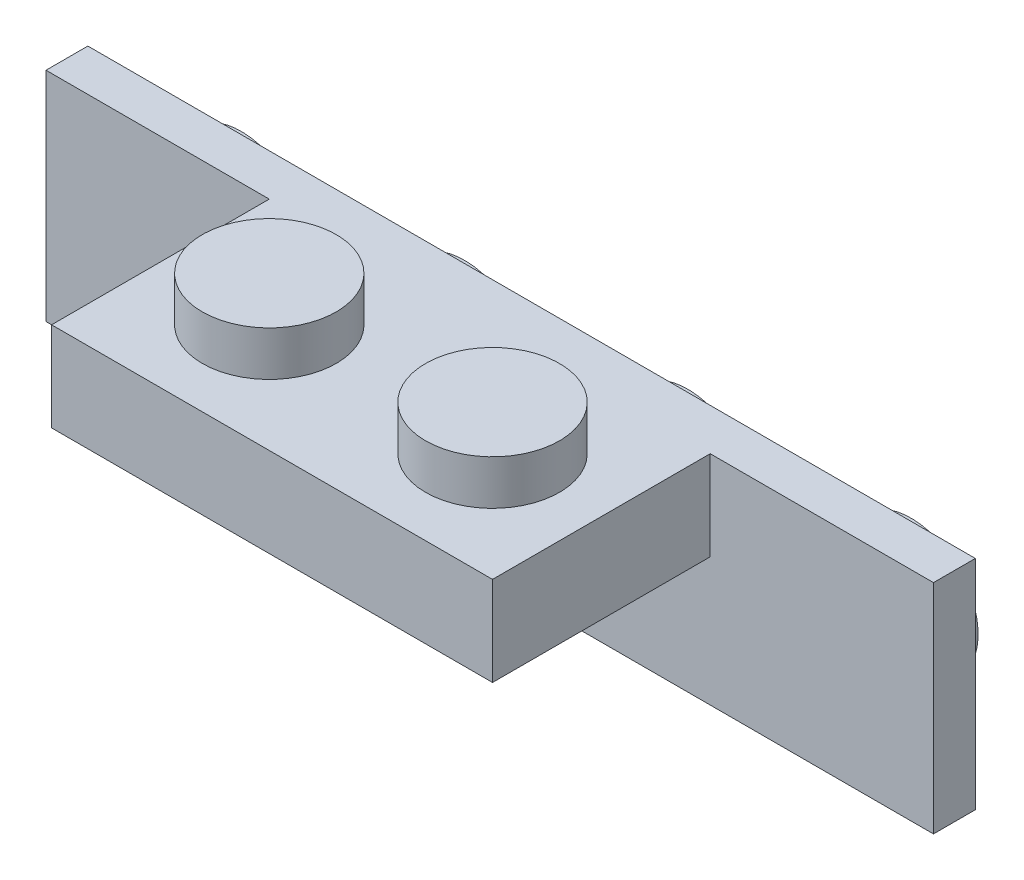
ISO-10303-21;
HEADER;
FILE_DESCRIPTION(('STEP AP214'),'2;1');
FILE_NAME('part.step','',(''),(''),'','','');
FILE_SCHEMA(('AUTOMOTIVE_DESIGN { 1 0 10303 214 1 1 1 1 }'));
ENDSEC;
DATA;
#1=APPLICATION_CONTEXT('core data for automotive mechanical design processes');
#2=APPLICATION_PROTOCOL_DEFINITION('international standard','automotive_design',2000,#1);
#3=PRODUCT_CONTEXT('',#1,'mechanical');
#4=PRODUCT('Part','Part','',(#3));
#5=PRODUCT_RELATED_PRODUCT_CATEGORY('part','',(#4));
#6=PRODUCT_DEFINITION_FORMATION('','',#4);
#7=PRODUCT_DEFINITION_CONTEXT('part definition',#1,'design');
#8=PRODUCT_DEFINITION('design','',#6,#7);
#9=PRODUCT_DEFINITION_SHAPE('','',#8);
#10=(LENGTH_UNIT() NAMED_UNIT(*) SI_UNIT(.MILLI.,.METRE.));
#11=(NAMED_UNIT(*) PLANE_ANGLE_UNIT() SI_UNIT($,.RADIAN.));
#12=(NAMED_UNIT(*) SI_UNIT($,.STERADIAN.) SOLID_ANGLE_UNIT());
#13=UNCERTAINTY_MEASURE_WITH_UNIT(LENGTH_MEASURE(1.E-05),#10,'distance_accuracy_value','');
#14=(GEOMETRIC_REPRESENTATION_CONTEXT(3) GLOBAL_UNCERTAINTY_ASSIGNED_CONTEXT((#13)) GLOBAL_UNIT_ASSIGNED_CONTEXT((#10,
#11,#12)) REPRESENTATION_CONTEXT('',''));
#15=CARTESIAN_POINT('',(0.,0.,0.));
#16=DIRECTION('',(0.,0.,1.));
#17=DIRECTION('',(1.,0.,0.));
#18=AXIS2_PLACEMENT_3D('',#15,#16,#17);
#19=CARTESIAN_POINT('',(0.,0.,-7.8));
#20=DIRECTION('',(0.,-1.,0.));
#21=DIRECTION('',(0.,0.,-1.));
#22=AXIS2_PLACEMENT_3D('',#19,#20,#21);
#23=PLANE('',#22);
#24=DIRECTION('',(1.,0.,0.));
#25=VECTOR('',#24,1.);
#26=CARTESIAN_POINT('',(0.,0.,0.));
#27=LINE('',#26,#25);
#28=CARTESIAN_POINT('',(0.,0.,0.));
#29=VERTEX_POINT('',#28);
#30=CARTESIAN_POINT('',(15.8,0.,0.));
#31=VERTEX_POINT('',#30);
#32=EDGE_CURVE('E103',#29,#31,#27,.T.);
#33=ORIENTED_EDGE('',*,*,#32,.F.);
#34=DIRECTION('',(0.,0.,1.));
#35=VECTOR('',#34,1.);
#36=CARTESIAN_POINT('',(0.,0.,-7.8));
#37=LINE('',#36,#35);
#38=CARTESIAN_POINT('',(0.,0.,-7.8));
#39=VERTEX_POINT('',#38);
#40=EDGE_CURVE('E119',#39,#29,#37,.T.);
#41=ORIENTED_EDGE('',*,*,#40,.F.);
#42=DIRECTION('',(1.,0.,0.));
#43=VECTOR('',#42,1.);
#44=CARTESIAN_POINT('',(0.,0.,-7.8));
#45=LINE('',#44,#43);
#46=CARTESIAN_POINT('',(15.8,0.,-7.8));
#47=VERTEX_POINT('',#46);
#48=EDGE_CURVE('E112',#39,#47,#45,.T.);
#49=ORIENTED_EDGE('',*,*,#48,.T.);
#50=DIRECTION('',(0.,0.,1.));
#51=VECTOR('',#50,1.);
#52=CARTESIAN_POINT('',(15.8,0.,-7.8));
#53=LINE('',#52,#51);
#54=EDGE_CURVE('E95',#47,#31,#53,.T.);
#55=ORIENTED_EDGE('',*,*,#54,.T.);
#56=EDGE_LOOP('',(#33,#41,#49,#55));
#57=FACE_BOUND('',#56,.T.);
#58=DIRECTION('',(0.,0.,1.));
#59=VECTOR('',#58,1.);
#60=CARTESIAN_POINT('',(1.2,0.,-7.8));
#61=LINE('',#60,#59);
#62=CARTESIAN_POINT('',(1.2,0.,-6.6));
#63=VERTEX_POINT('',#62);
#64=CARTESIAN_POINT('',(1.2,0.,-1.2));
#65=VERTEX_POINT('',#64);
#66=EDGE_CURVE('E306',#63,#65,#61,.T.);
#67=ORIENTED_EDGE('',*,*,#66,.T.);
#68=DIRECTION('',(1.,0.,0.));
#69=VECTOR('',#68,1.);
#70=CARTESIAN_POINT('',(0.,0.,-1.2));
#71=LINE('',#70,#69);
#72=CARTESIAN_POINT('',(14.6,0.,-1.2));
#73=VERTEX_POINT('',#72);
#74=EDGE_CURVE('E297',#65,#73,#71,.T.);
#75=ORIENTED_EDGE('',*,*,#74,.T.);
#76=DIRECTION('',(0.,0.,1.));
#77=VECTOR('',#76,1.);
#78=CARTESIAN_POINT('',(14.6,0.,-7.8));
#79=LINE('',#78,#77);
#80=CARTESIAN_POINT('',(14.6,0.,-6.6));
#81=VERTEX_POINT('',#80);
#82=EDGE_CURVE('E302',#81,#73,#79,.T.);
#83=ORIENTED_EDGE('',*,*,#82,.F.);
#84=DIRECTION('',(1.,0.,0.));
#85=VECTOR('',#84,1.);
#86=CARTESIAN_POINT('',(0.,0.,-6.6));
#87=LINE('',#86,#85);
#88=EDGE_CURVE('E57',#63,#81,#87,.T.);
#89=ORIENTED_EDGE('',*,*,#88,.F.);
#90=EDGE_LOOP('',(#67,#75,#83,#89));
#91=FACE_BOUND('',#90,.T.);
#92=ADVANCED_FACE('F42',(#57,#91),#23,.T.);
#93=CARTESIAN_POINT('',(0.,0.,-7.8));
#94=DIRECTION('',(-1.,0.,0.));
#95=DIRECTION('',(0.,0.,1.));
#96=AXIS2_PLACEMENT_3D('',#93,#94,#95);
#97=PLANE('',#96);
#98=DIRECTION('',(0.,-1.,0.));
#99=VECTOR('',#98,1.);
#100=CARTESIAN_POINT('',(0.,0.,0.));
#101=LINE('',#100,#99);
#102=CARTESIAN_POINT('',(0.,3.2,0.));
#103=VERTEX_POINT('',#102);
#104=EDGE_CURVE('E279',#103,#29,#101,.T.);
#105=ORIENTED_EDGE('',*,*,#104,.F.);
#106=DIRECTION('',(0.,0.,1.));
#107=VECTOR('',#106,1.);
#108=CARTESIAN_POINT('',(0.,3.2,-7.8));
#109=LINE('',#108,#107);
#110=CARTESIAN_POINT('',(0.,3.2,-7.8));
#111=VERTEX_POINT('',#110);
#112=EDGE_CURVE('E94',#111,#103,#109,.T.);
#113=ORIENTED_EDGE('',*,*,#112,.F.);
#114=DIRECTION('',(0.,-1.,0.));
#115=VECTOR('',#114,1.);
#116=CARTESIAN_POINT('',(0.,0.,-7.8));
#117=LINE('',#116,#115);
#118=EDGE_CURVE('E109',#111,#39,#117,.T.);
#119=ORIENTED_EDGE('',*,*,#118,.T.);
#120=ORIENTED_EDGE('',*,*,#40,.T.);
#121=EDGE_LOOP('',(#105,#113,#119,#120));
#122=FACE_BOUND('',#121,.T.);
#123=ADVANCED_FACE('F44',(#122),#97,.T.);
#124=CARTESIAN_POINT('',(0.,3.2,-7.8));
#125=DIRECTION('',(0.,1.,0.));
#126=DIRECTION('',(0.,0.,1.));
#127=AXIS2_PLACEMENT_3D('',#124,#125,#126);
#128=PLANE('',#127);
#129=CARTESIAN_POINT('',(11.9,3.2,-3.9));
#130=DIRECTION('',(0.,1.,0.));
#131=DIRECTION('',(0.,0.,1.));
#132=AXIS2_PLACEMENT_3D('',#129,#130,#131);
#133=CIRCLE('',#132,2.4);
#134=CARTESIAN_POINT('',(11.9,3.2,-1.5));
#135=VERTEX_POINT('',#134);
#136=EDGE_CURVE('E293',#135,#135,#133,.T.);
#137=ORIENTED_EDGE('',*,*,#136,.F.);
#138=EDGE_LOOP('',(#137));
#139=FACE_BOUND('',#138,.T.);
#140=CARTESIAN_POINT('',(3.9,3.2,-3.9));
#141=DIRECTION('',(0.,1.,0.));
#142=DIRECTION('',(0.,0.,1.));
#143=AXIS2_PLACEMENT_3D('',#140,#141,#142);
#144=CIRCLE('',#143,2.4);
#145=CARTESIAN_POINT('',(3.9,3.2,-1.5));
#146=VERTEX_POINT('',#145);
#147=EDGE_CURVE('E283',#146,#146,#144,.T.);
#148=ORIENTED_EDGE('',*,*,#147,.F.);
#149=EDGE_LOOP('',(#148));
#150=FACE_BOUND('',#149,.T.);
#151=DIRECTION('',(-1.,0.,0.));
#152=VECTOR('',#151,1.);
#153=CARTESIAN_POINT('',(0.,3.2,0.));
#154=LINE('',#153,#152);
#155=CARTESIAN_POINT('',(15.8,3.2,0.));
#156=VERTEX_POINT('',#155);
#157=EDGE_CURVE('E101',#156,#103,#154,.T.);
#158=ORIENTED_EDGE('',*,*,#157,.F.);
#159=DIRECTION('',(0.,0.,1.));
#160=VECTOR('',#159,1.);
#161=CARTESIAN_POINT('',(15.8,3.2,-7.8));
#162=LINE('',#161,#160);
#163=CARTESIAN_POINT('',(15.8,3.2,-7.8));
#164=VERTEX_POINT('',#163);
#165=EDGE_CURVE('E85',#164,#156,#162,.T.);
#166=ORIENTED_EDGE('',*,*,#165,.F.);
#167=DIRECTION('',(1.,0.,0.));
#168=VECTOR('',#167,1.);
#169=CARTESIAN_POINT('',(-8.,3.2,-7.8));
#170=LINE('',#169,#168);
#171=CARTESIAN_POINT('',(23.8,3.2,-7.8));
#172=VERTEX_POINT('',#171);
#173=EDGE_CURVE('E277',#164,#172,#170,.T.);
#174=ORIENTED_EDGE('',*,*,#173,.T.);
#175=DIRECTION('',(0.,0.,1.));
#176=VECTOR('',#175,1.);
#177=CARTESIAN_POINT('',(23.8,3.2,-9.3));
#178=LINE('',#177,#176);
#179=CARTESIAN_POINT('',(23.8,3.2,-9.3));
#180=VERTEX_POINT('',#179);
#181=EDGE_CURVE('E345',#180,#172,#178,.T.);
#182=ORIENTED_EDGE('',*,*,#181,.F.);
#183=DIRECTION('',(1.,0.,0.));
#184=VECTOR('',#183,1.);
#185=CARTESIAN_POINT('',(0.,3.2,-9.3));
#186=LINE('',#185,#184);
#187=CARTESIAN_POINT('',(-8.,3.2,-9.3));
#188=VERTEX_POINT('',#187);
#189=EDGE_CURVE('E276',#188,#180,#186,.T.);
#190=ORIENTED_EDGE('',*,*,#189,.F.);
#191=DIRECTION('',(0.,0.,1.));
#192=VECTOR('',#191,1.);
#193=CARTESIAN_POINT('',(-8.,3.2,-9.3));
#194=LINE('',#193,#192);
#195=CARTESIAN_POINT('',(-8.,3.2,-7.8));
#196=VERTEX_POINT('',#195);
#197=EDGE_CURVE('E275',#188,#196,#194,.T.);
#198=ORIENTED_EDGE('',*,*,#197,.T.);
#199=EDGE_CURVE('E266',#196,#111,#170,.T.);
#200=ORIENTED_EDGE('',*,*,#199,.T.);
#201=ORIENTED_EDGE('',*,*,#112,.T.);
#202=EDGE_LOOP('',(#158,#166,#174,#182,#190,#198,#200,#201));
#203=FACE_BOUND('',#202,.T.);
#204=ADVANCED_FACE('F105',(#139,#150,#203),#128,.T.);
#205=CARTESIAN_POINT('',(15.8,0.,-7.8));
#206=DIRECTION('',(1.,0.,0.));
#207=DIRECTION('',(0.,0.,-1.));
#208=AXIS2_PLACEMENT_3D('',#205,#206,#207);
#209=PLANE('',#208);
#210=DIRECTION('',(0.,1.,0.));
#211=VECTOR('',#210,1.);
#212=CARTESIAN_POINT('',(15.8,0.,0.));
#213=LINE('',#212,#211);
#214=EDGE_CURVE('E88',#31,#156,#213,.T.);
#215=ORIENTED_EDGE('',*,*,#214,.F.);
#216=ORIENTED_EDGE('',*,*,#54,.F.);
#217=DIRECTION('',(0.,1.,0.));
#218=VECTOR('',#217,1.);
#219=CARTESIAN_POINT('',(15.8,0.,-7.8));
#220=LINE('',#219,#218);
#221=EDGE_CURVE('E66',#47,#164,#220,.T.);
#222=ORIENTED_EDGE('',*,*,#221,.T.);
#223=ORIENTED_EDGE('',*,*,#165,.T.);
#224=EDGE_LOOP('',(#215,#216,#222,#223));
#225=FACE_BOUND('',#224,.T.);
#226=ADVANCED_FACE('F87',(#225),#209,.T.);
#227=CARTESIAN_POINT('',(0.,0.,0.));
#228=DIRECTION('',(0.,0.,-1.));
#229=DIRECTION('',(-1.,0.,0.));
#230=AXIS2_PLACEMENT_3D('',#227,#228,#229);
#231=PLANE('',#230);
#232=ORIENTED_EDGE('',*,*,#104,.T.);
#233=ORIENTED_EDGE('',*,*,#32,.T.);
#234=ORIENTED_EDGE('',*,*,#214,.T.);
#235=ORIENTED_EDGE('',*,*,#157,.T.);
#236=EDGE_LOOP('',(#232,#233,#234,#235));
#237=FACE_BOUND('',#236,.T.);
#238=ADVANCED_FACE('F100',(#237),#231,.F.);
#239=CARTESIAN_POINT('',(3.9,4.8,-3.9));
#240=DIRECTION('',(0.,-1.,0.));
#241=DIRECTION('',(0.,0.,-1.));
#242=AXIS2_PLACEMENT_3D('',#239,#240,#241);
#243=CYLINDRICAL_SURFACE('',#242,2.4);
#244=CARTESIAN_POINT('',(3.9,4.8,-3.9));
#245=DIRECTION('',(0.,1.,0.));
#246=DIRECTION('',(0.,0.,1.));
#247=AXIS2_PLACEMENT_3D('',#244,#245,#246);
#248=CIRCLE('',#247,2.4);
#249=CARTESIAN_POINT('',(3.9,4.8,-1.5));
#250=VERTEX_POINT('',#249);
#251=EDGE_CURVE('E280',#250,#250,#248,.T.);
#252=ORIENTED_EDGE('',*,*,#251,.F.);
#253=EDGE_LOOP('',(#252));
#254=FACE_BOUND('',#253,.T.);
#255=ORIENTED_EDGE('',*,*,#147,.T.);
#256=EDGE_LOOP('',(#255));
#257=FACE_BOUND('',#256,.T.);
#258=ADVANCED_FACE('F175',(#254,#257),#243,.T.);
#259=CARTESIAN_POINT('',(3.9,4.8,-3.9));
#260=DIRECTION('',(0.,1.,0.));
#261=DIRECTION('',(0.,0.,1.));
#262=AXIS2_PLACEMENT_3D('',#259,#260,#261);
#263=PLANE('',#262);
#264=ORIENTED_EDGE('',*,*,#251,.T.);
#265=EDGE_LOOP('',(#264));
#266=FACE_BOUND('',#265,.T.);
#267=ADVANCED_FACE('F178',(#266),#263,.T.);
#268=CARTESIAN_POINT('',(11.9,4.8,-3.9));
#269=DIRECTION('',(0.,-1.,0.));
#270=DIRECTION('',(0.,0.,-1.));
#271=AXIS2_PLACEMENT_3D('',#268,#269,#270);
#272=CYLINDRICAL_SURFACE('',#271,2.4);
#273=CARTESIAN_POINT('',(11.9,4.8,-3.9));
#274=DIRECTION('',(0.,1.,0.));
#275=DIRECTION('',(0.,0.,1.));
#276=AXIS2_PLACEMENT_3D('',#273,#274,#275);
#277=CIRCLE('',#276,2.4);
#278=CARTESIAN_POINT('',(11.9,4.8,-1.5));
#279=VERTEX_POINT('',#278);
#280=EDGE_CURVE('E289',#279,#279,#277,.T.);
#281=ORIENTED_EDGE('',*,*,#280,.F.);
#282=EDGE_LOOP('',(#281));
#283=FACE_BOUND('',#282,.T.);
#284=ORIENTED_EDGE('',*,*,#136,.T.);
#285=EDGE_LOOP('',(#284));
#286=FACE_BOUND('',#285,.T.);
#287=ADVANCED_FACE('F182',(#283,#286),#272,.T.);
#288=CARTESIAN_POINT('',(11.9,4.8,-3.9));
#289=DIRECTION('',(0.,1.,0.));
#290=DIRECTION('',(0.,0.,1.));
#291=AXIS2_PLACEMENT_3D('',#288,#289,#290);
#292=PLANE('',#291);
#293=ORIENTED_EDGE('',*,*,#280,.T.);
#294=EDGE_LOOP('',(#293));
#295=FACE_BOUND('',#294,.T.);
#296=ADVANCED_FACE('F186',(#295),#292,.T.);
#297=CARTESIAN_POINT('',(1.2,0.,-7.8));
#298=DIRECTION('',(-1.,0.,0.));
#299=DIRECTION('',(0.,0.,1.));
#300=AXIS2_PLACEMENT_3D('',#297,#298,#299);
#301=PLANE('',#300);
#302=DIRECTION('',(0.,-1.,0.));
#303=VECTOR('',#302,1.);
#304=CARTESIAN_POINT('',(1.2,0.,-1.2));
#305=LINE('',#304,#303);
#306=CARTESIAN_POINT('',(1.2,2.,-1.2));
#307=VERTEX_POINT('',#306);
#308=EDGE_CURVE('E301',#307,#65,#305,.T.);
#309=ORIENTED_EDGE('',*,*,#308,.T.);
#310=ORIENTED_EDGE('',*,*,#66,.F.);
#311=DIRECTION('',(0.,-1.,0.));
#312=VECTOR('',#311,1.);
#313=CARTESIAN_POINT('',(1.2,0.,-6.6));
#314=LINE('',#313,#312);
#315=CARTESIAN_POINT('',(1.2,2.,-6.6));
#316=VERTEX_POINT('',#315);
#317=EDGE_CURVE('E309',#316,#63,#314,.T.);
#318=ORIENTED_EDGE('',*,*,#317,.F.);
#319=DIRECTION('',(0.,0.,1.));
#320=VECTOR('',#319,1.);
#321=CARTESIAN_POINT('',(1.2,2.,-7.8));
#322=LINE('',#321,#320);
#323=EDGE_CURVE('E296',#316,#307,#322,.T.);
#324=ORIENTED_EDGE('',*,*,#323,.T.);
#325=EDGE_LOOP('',(#309,#310,#318,#324));
#326=FACE_BOUND('',#325,.T.);
#327=ADVANCED_FACE('F190',(#326),#301,.F.);
#328=CARTESIAN_POINT('',(0.,2.,-7.8));
#329=DIRECTION('',(0.,1.,0.));
#330=DIRECTION('',(0.,0.,1.));
#331=AXIS2_PLACEMENT_3D('',#328,#329,#330);
#332=PLANE('',#331);
#333=CARTESIAN_POINT('',(7.9,2.,-3.9));
#334=DIRECTION('',(0.,1.,0.));
#335=DIRECTION('',(0.,0.,1.));
#336=AXIS2_PLACEMENT_3D('',#333,#334,#335);
#337=CIRCLE('',#336,1.5);
#338=CARTESIAN_POINT('',(7.9,2.,-2.4));
#339=VERTEX_POINT('',#338);
#340=EDGE_CURVE('E116',#339,#339,#337,.F.);
#341=ORIENTED_EDGE('',*,*,#340,.F.);
#342=EDGE_LOOP('',(#341));
#343=FACE_BOUND('',#342,.T.);
#344=CARTESIAN_POINT('',(11.9,2.,-3.9));
#345=DIRECTION('',(0.,1.,0.));
#346=DIRECTION('',(0.,0.,1.));
#347=AXIS2_PLACEMENT_3D('',#344,#345,#346);
#348=CIRCLE('',#347,1.2);
#349=CARTESIAN_POINT('',(11.9,2.,-2.7));
#350=VERTEX_POINT('',#349);
#351=EDGE_CURVE('E317',#350,#350,#348,.T.);
#352=ORIENTED_EDGE('',*,*,#351,.T.);
#353=EDGE_LOOP('',(#352));
#354=FACE_BOUND('',#353,.T.);
#355=CARTESIAN_POINT('',(3.9,2.,-3.9));
#356=DIRECTION('',(0.,1.,0.));
#357=DIRECTION('',(0.,0.,1.));
#358=AXIS2_PLACEMENT_3D('',#355,#356,#357);
#359=CIRCLE('',#358,1.2);
#360=CARTESIAN_POINT('',(3.9,2.,-2.7));
#361=VERTEX_POINT('',#360);
#362=EDGE_CURVE('E316',#361,#361,#359,.T.);
#363=ORIENTED_EDGE('',*,*,#362,.T.);
#364=EDGE_LOOP('',(#363));
#365=FACE_BOUND('',#364,.T.);
#366=DIRECTION('',(-1.,0.,0.));
#367=VECTOR('',#366,1.);
#368=CARTESIAN_POINT('',(0.,2.,-1.2));
#369=LINE('',#368,#367);
#370=CARTESIAN_POINT('',(14.6,2.,-1.2));
#371=VERTEX_POINT('',#370);
#372=EDGE_CURVE('E324',#371,#307,#369,.T.);
#373=ORIENTED_EDGE('',*,*,#372,.T.);
#374=ORIENTED_EDGE('',*,*,#323,.F.);
#375=DIRECTION('',(-1.,0.,0.));
#376=VECTOR('',#375,1.);
#377=CARTESIAN_POINT('',(0.,2.,-6.6));
#378=LINE('',#377,#376);
#379=CARTESIAN_POINT('',(14.6,2.,-6.6));
#380=VERTEX_POINT('',#379);
#381=EDGE_CURVE('E312',#380,#316,#378,.T.);
#382=ORIENTED_EDGE('',*,*,#381,.F.);
#383=DIRECTION('',(0.,0.,1.));
#384=VECTOR('',#383,1.);
#385=CARTESIAN_POINT('',(14.6,2.,-7.8));
#386=LINE('',#385,#384);
#387=EDGE_CURVE('E305',#380,#371,#386,.T.);
#388=ORIENTED_EDGE('',*,*,#387,.T.);
#389=EDGE_LOOP('',(#373,#374,#382,#388));
#390=FACE_BOUND('',#389,.T.);
#391=ADVANCED_FACE('F219',(#343,#354,#365,#390),#332,.F.);
#392=CARTESIAN_POINT('',(14.6,0.,-7.8));
#393=DIRECTION('',(1.,0.,0.));
#394=DIRECTION('',(0.,0.,-1.));
#395=AXIS2_PLACEMENT_3D('',#392,#393,#394);
#396=PLANE('',#395);
#397=DIRECTION('',(0.,1.,0.));
#398=VECTOR('',#397,1.);
#399=CARTESIAN_POINT('',(14.6,0.,-1.2));
#400=LINE('',#399,#398);
#401=EDGE_CURVE('E300',#73,#371,#400,.T.);
#402=ORIENTED_EDGE('',*,*,#401,.T.);
#403=ORIENTED_EDGE('',*,*,#387,.F.);
#404=DIRECTION('',(0.,1.,0.));
#405=VECTOR('',#404,1.);
#406=CARTESIAN_POINT('',(14.6,0.,-6.6));
#407=LINE('',#406,#405);
#408=EDGE_CURVE('E308',#81,#380,#407,.T.);
#409=ORIENTED_EDGE('',*,*,#408,.F.);
#410=ORIENTED_EDGE('',*,*,#82,.T.);
#411=EDGE_LOOP('',(#402,#403,#409,#410));
#412=FACE_BOUND('',#411,.T.);
#413=ADVANCED_FACE('F216',(#412),#396,.F.);
#414=CARTESIAN_POINT('',(0.,0.,-6.6));
#415=DIRECTION('',(0.,0.,-1.));
#416=DIRECTION('',(-1.,0.,0.));
#417=AXIS2_PLACEMENT_3D('',#414,#415,#416);
#418=PLANE('',#417);
#419=ORIENTED_EDGE('',*,*,#317,.T.);
#420=ORIENTED_EDGE('',*,*,#88,.T.);
#421=ORIENTED_EDGE('',*,*,#408,.T.);
#422=ORIENTED_EDGE('',*,*,#381,.T.);
#423=EDGE_LOOP('',(#419,#420,#421,#422));
#424=FACE_BOUND('',#423,.T.);
#425=ADVANCED_FACE('F212',(#424),#418,.F.);
#426=CARTESIAN_POINT('',(0.,0.,-1.2));
#427=DIRECTION('',(0.,0.,-1.));
#428=DIRECTION('',(-1.,0.,0.));
#429=AXIS2_PLACEMENT_3D('',#426,#427,#428);
#430=PLANE('',#429);
#431=ORIENTED_EDGE('',*,*,#308,.F.);
#432=ORIENTED_EDGE('',*,*,#372,.F.);
#433=ORIENTED_EDGE('',*,*,#401,.F.);
#434=ORIENTED_EDGE('',*,*,#74,.F.);
#435=EDGE_LOOP('',(#431,#432,#433,#434));
#436=FACE_BOUND('',#435,.T.);
#437=ADVANCED_FACE('F208',(#436),#430,.T.);
#438=CARTESIAN_POINT('',(3.9,4.8,-3.9));
#439=DIRECTION('',(0.,-1.,0.));
#440=DIRECTION('',(0.,0.,-1.));
#441=AXIS2_PLACEMENT_3D('',#438,#439,#440);
#442=CYLINDRICAL_SURFACE('',#441,1.2);
#443=CARTESIAN_POINT('',(3.9,3.6,-3.9));
#444=DIRECTION('',(0.,1.,0.));
#445=DIRECTION('',(0.,0.,1.));
#446=AXIS2_PLACEMENT_3D('',#443,#444,#445);
#447=CIRCLE('',#446,1.2);
#448=CARTESIAN_POINT('',(3.9,3.6,-2.7));
#449=VERTEX_POINT('',#448);
#450=EDGE_CURVE('E318',#449,#449,#447,.T.);
#451=ORIENTED_EDGE('',*,*,#450,.T.);
#452=EDGE_LOOP('',(#451));
#453=FACE_BOUND('',#452,.T.);
#454=ORIENTED_EDGE('',*,*,#362,.F.);
#455=EDGE_LOOP('',(#454));
#456=FACE_BOUND('',#455,.T.);
#457=ADVANCED_FACE('F204',(#453,#456),#442,.F.);
#458=CARTESIAN_POINT('',(3.9,3.6,-3.9));
#459=DIRECTION('',(0.,1.,0.));
#460=DIRECTION('',(0.,0.,1.));
#461=AXIS2_PLACEMENT_3D('',#458,#459,#460);
#462=PLANE('',#461);
#463=ORIENTED_EDGE('',*,*,#450,.F.);
#464=EDGE_LOOP('',(#463));
#465=FACE_BOUND('',#464,.T.);
#466=ADVANCED_FACE('F200',(#465),#462,.F.);
#467=CARTESIAN_POINT('',(11.9,4.8,-3.9));
#468=DIRECTION('',(0.,-1.,0.));
#469=DIRECTION('',(0.,0.,-1.));
#470=AXIS2_PLACEMENT_3D('',#467,#468,#469);
#471=CYLINDRICAL_SURFACE('',#470,1.2);
#472=CARTESIAN_POINT('',(11.9,3.6,-3.9));
#473=DIRECTION('',(0.,1.,0.));
#474=DIRECTION('',(0.,0.,1.));
#475=AXIS2_PLACEMENT_3D('',#472,#473,#474);
#476=CIRCLE('',#475,1.2);
#477=CARTESIAN_POINT('',(11.9,3.6,-2.7));
#478=VERTEX_POINT('',#477);
#479=EDGE_CURVE('E313',#478,#478,#476,.T.);
#480=ORIENTED_EDGE('',*,*,#479,.T.);
#481=EDGE_LOOP('',(#480));
#482=FACE_BOUND('',#481,.T.);
#483=ORIENTED_EDGE('',*,*,#351,.F.);
#484=EDGE_LOOP('',(#483));
#485=FACE_BOUND('',#484,.T.);
#486=ADVANCED_FACE('F196',(#482,#485),#471,.F.);
#487=CARTESIAN_POINT('',(11.9,3.6,-3.9));
#488=DIRECTION('',(0.,1.,0.));
#489=DIRECTION('',(0.,0.,1.));
#490=AXIS2_PLACEMENT_3D('',#487,#488,#489);
#491=PLANE('',#490);
#492=ORIENTED_EDGE('',*,*,#479,.F.);
#493=EDGE_LOOP('',(#492));
#494=FACE_BOUND('',#493,.T.);
#495=ADVANCED_FACE('F192',(#494),#491,.F.);
#496=CARTESIAN_POINT('',(7.9,-4.24264068711929,-3.9));
#497=DIRECTION('',(0.,1.,0.));
#498=DIRECTION('',(0.,0.,1.));
#499=AXIS2_PLACEMENT_3D('',#496,#497,#498);
#500=CYLINDRICAL_SURFACE('',#499,1.5);
#501=ORIENTED_EDGE('',*,*,#340,.T.);
#502=EDGE_LOOP('',(#501));
#503=FACE_BOUND('',#502,.T.);
#504=CARTESIAN_POINT('',(7.9,0.2,-3.9));
#505=DIRECTION('',(0.,-1.,0.));
#506=DIRECTION('',(0.,0.,-1.));
#507=AXIS2_PLACEMENT_3D('',#504,#505,#506);
#508=CIRCLE('',#507,1.5);
#509=CARTESIAN_POINT('',(7.9,0.2,-5.4));
#510=VERTEX_POINT('',#509);
#511=EDGE_CURVE('E335',#510,#510,#508,.T.);
#512=ORIENTED_EDGE('',*,*,#511,.F.);
#513=EDGE_LOOP('',(#512));
#514=FACE_BOUND('',#513,.T.);
#515=ADVANCED_FACE('F195',(#503,#514),#500,.T.);
#516=CARTESIAN_POINT('',(7.9,-4.24264068711929,-3.9));
#517=DIRECTION('',(0.,1.,0.));
#518=DIRECTION('',(0.,0.,1.));
#519=AXIS2_PLACEMENT_3D('',#516,#517,#518);
#520=CYLINDRICAL_SURFACE('',#519,0.6);
#521=CARTESIAN_POINT('',(7.9,2.,-3.9));
#522=DIRECTION('',(0.,-1.,0.));
#523=DIRECTION('',(0.,0.,-1.));
#524=AXIS2_PLACEMENT_3D('',#521,#522,#523);
#525=CIRCLE('',#524,0.6);
#526=CARTESIAN_POINT('',(7.9,2.,-4.5));
#527=VERTEX_POINT('',#526);
#528=EDGE_CURVE('E344',#527,#527,#525,.T.);
#529=ORIENTED_EDGE('',*,*,#528,.F.);
#530=EDGE_LOOP('',(#529));
#531=FACE_BOUND('',#530,.T.);
#532=CARTESIAN_POINT('',(7.9,0.2,-3.9));
#533=DIRECTION('',(0.,-1.,0.));
#534=DIRECTION('',(0.,0.,-1.));
#535=AXIS2_PLACEMENT_3D('',#532,#533,#534);
#536=CIRCLE('',#535,0.6);
#537=CARTESIAN_POINT('',(7.9,0.2,-4.5));
#538=VERTEX_POINT('',#537);
#539=EDGE_CURVE('E341',#538,#538,#536,.T.);
#540=ORIENTED_EDGE('',*,*,#539,.T.);
#541=EDGE_LOOP('',(#540));
#542=FACE_BOUND('',#541,.T.);
#543=ADVANCED_FACE('F230',(#531,#542),#520,.F.);
#544=CARTESIAN_POINT('',(0.,0.2,-7.8));
#545=DIRECTION('',(0.,-1.,0.));
#546=DIRECTION('',(0.,0.,-1.));
#547=AXIS2_PLACEMENT_3D('',#544,#545,#546);
#548=PLANE('',#547);
#549=ORIENTED_EDGE('',*,*,#539,.F.);
#550=EDGE_LOOP('',(#549));
#551=FACE_BOUND('',#550,.T.);
#552=ORIENTED_EDGE('',*,*,#511,.T.);
#553=EDGE_LOOP('',(#552));
#554=FACE_BOUND('',#553,.T.);
#555=ADVANCED_FACE('F234',(#551,#554),#548,.T.);
#556=ORIENTED_EDGE('',*,*,#528,.T.);
#557=EDGE_LOOP('',(#556));
#558=FACE_BOUND('',#557,.T.);
#559=ADVANCED_FACE('F224',(#558),#332,.F.);
#560=CARTESIAN_POINT('',(23.8,3.2,-9.3));
#561=DIRECTION('',(-1.,0.,0.));
#562=DIRECTION('',(0.,0.,1.));
#563=AXIS2_PLACEMENT_3D('',#560,#561,#562);
#564=PLANE('',#563);
#565=DIRECTION('',(0.,-1.,0.));
#566=VECTOR('',#565,1.);
#567=CARTESIAN_POINT('',(23.8,3.2,-7.8));
#568=LINE('',#567,#566);
#569=CARTESIAN_POINT('',(23.8,-4.6,-7.8));
#570=VERTEX_POINT('',#569);
#571=EDGE_CURVE('E366',#172,#570,#568,.T.);
#572=ORIENTED_EDGE('',*,*,#571,.T.);
#573=DIRECTION('',(0.,0.,1.));
#574=VECTOR('',#573,1.);
#575=CARTESIAN_POINT('',(23.8,-4.6,-9.3));
#576=LINE('',#575,#574);
#577=CARTESIAN_POINT('',(23.8,-4.6,-9.3));
#578=VERTEX_POINT('',#577);
#579=EDGE_CURVE('E352',#578,#570,#576,.T.);
#580=ORIENTED_EDGE('',*,*,#579,.F.);
#581=DIRECTION('',(0.,-1.,0.));
#582=VECTOR('',#581,1.);
#583=CARTESIAN_POINT('',(23.8,3.2,-9.3));
#584=LINE('',#583,#582);
#585=EDGE_CURVE('E375',#180,#578,#584,.T.);
#586=ORIENTED_EDGE('',*,*,#585,.F.);
#587=ORIENTED_EDGE('',*,*,#181,.T.);
#588=EDGE_LOOP('',(#572,#580,#586,#587));
#589=FACE_BOUND('',#588,.T.);
#590=ADVANCED_FACE('F239',(#589),#564,.F.);
#591=CARTESIAN_POINT('',(23.8,-4.6,-9.3));
#592=DIRECTION('',(0.,1.,0.));
#593=DIRECTION('',(0.,0.,1.));
#594=AXIS2_PLACEMENT_3D('',#591,#592,#593);
#595=PLANE('',#594);
#596=DIRECTION('',(-1.,0.,0.));
#597=VECTOR('',#596,1.);
#598=CARTESIAN_POINT('',(23.8,-4.6,-7.8));
#599=LINE('',#598,#597);
#600=CARTESIAN_POINT('',(-8.,-4.6,-7.8));
#601=VERTEX_POINT('',#600);
#602=EDGE_CURVE('E363',#570,#601,#599,.T.);
#603=ORIENTED_EDGE('',*,*,#602,.T.);
#604=DIRECTION('',(0.,0.,1.));
#605=VECTOR('',#604,1.);
#606=CARTESIAN_POINT('',(-8.,-4.6,-9.3));
#607=LINE('',#606,#605);
#608=CARTESIAN_POINT('',(-8.,-4.6,-9.3));
#609=VERTEX_POINT('',#608);
#610=EDGE_CURVE('E355',#609,#601,#607,.T.);
#611=ORIENTED_EDGE('',*,*,#610,.F.);
#612=DIRECTION('',(-1.,0.,0.));
#613=VECTOR('',#612,1.);
#614=CARTESIAN_POINT('',(23.8,-4.6,-9.3));
#615=LINE('',#614,#613);
#616=EDGE_CURVE('E372',#578,#609,#615,.T.);
#617=ORIENTED_EDGE('',*,*,#616,.F.);
#618=ORIENTED_EDGE('',*,*,#579,.T.);
#619=EDGE_LOOP('',(#603,#611,#617,#618));
#620=FACE_BOUND('',#619,.T.);
#621=ADVANCED_FACE('F242',(#620),#595,.F.);
#622=CARTESIAN_POINT('',(-8.,-4.6,-9.3));
#623=DIRECTION('',(1.,0.,0.));
#624=DIRECTION('',(0.,0.,-1.));
#625=AXIS2_PLACEMENT_3D('',#622,#623,#624);
#626=PLANE('',#625);
#627=DIRECTION('',(0.,1.,0.));
#628=VECTOR('',#627,1.);
#629=CARTESIAN_POINT('',(-8.,-4.6,-7.8));
#630=LINE('',#629,#628);
#631=EDGE_CURVE('E360',#601,#196,#630,.T.);
#632=ORIENTED_EDGE('',*,*,#631,.T.);
#633=ORIENTED_EDGE('',*,*,#197,.F.);
#634=DIRECTION('',(0.,1.,0.));
#635=VECTOR('',#634,1.);
#636=CARTESIAN_POINT('',(-8.,-4.6,-9.3));
#637=LINE('',#636,#635);
#638=EDGE_CURVE('E358',#609,#188,#637,.T.);
#639=ORIENTED_EDGE('',*,*,#638,.F.);
#640=ORIENTED_EDGE('',*,*,#610,.T.);
#641=EDGE_LOOP('',(#632,#633,#639,#640));
#642=FACE_BOUND('',#641,.T.);
#643=ADVANCED_FACE('F246',(#642),#626,.F.);
#644=CARTESIAN_POINT('',(0.,0.,-9.3));
#645=DIRECTION('',(0.,0.,-1.));
#646=DIRECTION('',(-1.,0.,0.));
#647=AXIS2_PLACEMENT_3D('',#644,#645,#646);
#648=PLANE('',#647);
#649=CARTESIAN_POINT('',(19.9,-0.699999999999999,-9.3));
#650=DIRECTION('',(0.,0.,-1.));
#651=DIRECTION('',(-1.,0.,0.));
#652=AXIS2_PLACEMENT_3D('',#649,#650,#651);
#653=CIRCLE('',#652,2.4);
#654=CARTESIAN_POINT('',(17.5,-0.699999999999999,-9.3));
#655=VERTEX_POINT('',#654);
#656=EDGE_CURVE('E407',#655,#655,#653,.T.);
#657=ORIENTED_EDGE('',*,*,#656,.F.);
#658=EDGE_LOOP('',(#657));
#659=FACE_BOUND('',#658,.T.);
#660=CARTESIAN_POINT('',(11.9,-0.699999999999998,-9.3));
#661=DIRECTION('',(0.,0.,-1.));
#662=DIRECTION('',(-1.,0.,0.));
#663=AXIS2_PLACEMENT_3D('',#660,#661,#662);
#664=CIRCLE('',#663,2.4);
#665=CARTESIAN_POINT('',(9.5,-0.699999999999998,-9.3));
#666=VERTEX_POINT('',#665);
#667=EDGE_CURVE('E398',#666,#666,#664,.T.);
#668=ORIENTED_EDGE('',*,*,#667,.F.);
#669=EDGE_LOOP('',(#668));
#670=FACE_BOUND('',#669,.T.);
#671=CARTESIAN_POINT('',(3.9,-0.699999999999997,-9.3));
#672=DIRECTION('',(0.,0.,-1.));
#673=DIRECTION('',(-1.,0.,0.));
#674=AXIS2_PLACEMENT_3D('',#671,#672,#673);
#675=CIRCLE('',#674,2.4);
#676=CARTESIAN_POINT('',(1.5,-0.699999999999997,-9.3));
#677=VERTEX_POINT('',#676);
#678=EDGE_CURVE('E389',#677,#677,#675,.T.);
#679=ORIENTED_EDGE('',*,*,#678,.F.);
#680=EDGE_LOOP('',(#679));
#681=FACE_BOUND('',#680,.T.);
#682=CARTESIAN_POINT('',(-4.1,-0.699999999999997,-9.3));
#683=DIRECTION('',(0.,0.,-1.));
#684=DIRECTION('',(-1.,0.,0.));
#685=AXIS2_PLACEMENT_3D('',#682,#683,#684);
#686=CIRCLE('',#685,2.4);
#687=CARTESIAN_POINT('',(-6.5,-0.699999999999997,-9.3));
#688=VERTEX_POINT('',#687);
#689=EDGE_CURVE('E380',#688,#688,#686,.T.);
#690=ORIENTED_EDGE('',*,*,#689,.F.);
#691=EDGE_LOOP('',(#690));
#692=FACE_BOUND('',#691,.T.);
#693=ORIENTED_EDGE('',*,*,#189,.T.);
#694=ORIENTED_EDGE('',*,*,#585,.T.);
#695=ORIENTED_EDGE('',*,*,#616,.T.);
#696=ORIENTED_EDGE('',*,*,#638,.T.);
#697=EDGE_LOOP('',(#693,#694,#695,#696));
#698=FACE_BOUND('',#697,.T.);
#699=ADVANCED_FACE('F149',(#659,#670,#681,#692,#698),#648,.T.);
#700=CARTESIAN_POINT('',(0.,0.,-7.8));
#701=DIRECTION('',(0.,0.,-1.));
#702=DIRECTION('',(-1.,0.,0.));
#703=AXIS2_PLACEMENT_3D('',#700,#701,#702);
#704=PLANE('',#703);
#705=ORIENTED_EDGE('',*,*,#118,.F.);
#706=ORIENTED_EDGE('',*,*,#199,.F.);
#707=ORIENTED_EDGE('',*,*,#631,.F.);
#708=ORIENTED_EDGE('',*,*,#602,.F.);
#709=ORIENTED_EDGE('',*,*,#571,.F.);
#710=ORIENTED_EDGE('',*,*,#173,.F.);
#711=ORIENTED_EDGE('',*,*,#221,.F.);
#712=ORIENTED_EDGE('',*,*,#48,.F.);
#713=EDGE_LOOP('',(#705,#706,#707,#708,#709,#710,#711,#712));
#714=FACE_BOUND('',#713,.T.);
#715=ADVANCED_FACE('F250',(#714),#704,.F.);
#716=CARTESIAN_POINT('',(-4.1,-0.699999999999997,-10.9));
#717=DIRECTION('',(0.,0.,-1.));
#718=DIRECTION('',(-1.,0.,0.));
#719=AXIS2_PLACEMENT_3D('',#716,#717,#718);
#720=PLANE('',#719);
#721=CARTESIAN_POINT('',(-4.1,-0.699999999999997,-10.9));
#722=DIRECTION('',(0.,0.,-1.));
#723=DIRECTION('',(-1.,0.,0.));
#724=AXIS2_PLACEMENT_3D('',#721,#722,#723);
#725=CIRCLE('',#724,2.4);
#726=CARTESIAN_POINT('',(-6.5,-0.699999999999997,-10.9));
#727=VERTEX_POINT('',#726);
#728=EDGE_CURVE('E369',#727,#727,#725,.T.);
#729=ORIENTED_EDGE('',*,*,#728,.T.);
#730=EDGE_LOOP('',(#729));
#731=FACE_BOUND('',#730,.T.);
#732=CARTESIAN_POINT('',(-4.1,-0.699999999999997,-10.9));
#733=DIRECTION('',(0.,0.,-1.));
#734=DIRECTION('',(-1.,0.,0.));
#735=AXIS2_PLACEMENT_3D('',#732,#733,#734);
#736=CIRCLE('',#735,1.55);
#737=CARTESIAN_POINT('',(-5.65,-0.699999999999997,-10.9));
#738=VERTEX_POINT('',#737);
#739=EDGE_CURVE('E383',#738,#738,#736,.T.);
#740=ORIENTED_EDGE('',*,*,#739,.F.);
#741=EDGE_LOOP('',(#740));
#742=FACE_BOUND('',#741,.T.);
#743=ADVANCED_FACE('F252',(#731,#742),#720,.T.);
#744=CARTESIAN_POINT('',(-4.1,-0.699999999999997,-10.9));
#745=DIRECTION('',(0.,0.,1.));
#746=DIRECTION('',(1.,0.,0.));
#747=AXIS2_PLACEMENT_3D('',#744,#745,#746);
#748=CYLINDRICAL_SURFACE('',#747,2.4);
#749=ORIENTED_EDGE('',*,*,#728,.F.);
#750=EDGE_LOOP('',(#749));
#751=FACE_BOUND('',#750,.T.);
#752=ORIENTED_EDGE('',*,*,#689,.T.);
#753=EDGE_LOOP('',(#752));
#754=FACE_BOUND('',#753,.T.);
#755=ADVANCED_FACE('F257',(#751,#754),#748,.T.);
#756=CARTESIAN_POINT('',(-4.1,-0.699999999999997,-10.9));
#757=DIRECTION('',(0.,0.,1.));
#758=DIRECTION('',(1.,0.,0.));
#759=AXIS2_PLACEMENT_3D('',#756,#757,#758);
#760=CYLINDRICAL_SURFACE('',#759,1.55);
#761=ORIENTED_EDGE('',*,*,#739,.T.);
#762=EDGE_LOOP('',(#761));
#763=FACE_BOUND('',#762,.T.);
#764=CARTESIAN_POINT('',(-4.1,-0.699999999999997,-9.3));
#765=DIRECTION('',(0.,0.,-1.));
#766=DIRECTION('',(-1.,0.,0.));
#767=AXIS2_PLACEMENT_3D('',#764,#765,#766);
#768=CIRCLE('',#767,1.55);
#769=CARTESIAN_POINT('',(-5.65,-0.699999999999997,-9.3));
#770=VERTEX_POINT('',#769);
#771=EDGE_CURVE('E123',#770,#770,#768,.F.);
#772=ORIENTED_EDGE('',*,*,#771,.T.);
#773=EDGE_LOOP('',(#772));
#774=FACE_BOUND('',#773,.T.);
#775=ADVANCED_FACE('F444',(#763,#774),#760,.F.);
#776=ORIENTED_EDGE('',*,*,#771,.F.);
#777=EDGE_LOOP('',(#776));
#778=FACE_BOUND('',#777,.T.);
#779=ADVANCED_FACE('F156',(#778),#648,.T.);
#780=CARTESIAN_POINT('',(3.9,-0.699999999999997,-10.9));
#781=DIRECTION('',(0.,0.,-1.));
#782=DIRECTION('',(-1.,0.,0.));
#783=AXIS2_PLACEMENT_3D('',#780,#781,#782);
#784=PLANE('',#783);
#785=CARTESIAN_POINT('',(3.9,-0.699999999999997,-10.9));
#786=DIRECTION('',(0.,0.,-1.));
#787=DIRECTION('',(-1.,0.,0.));
#788=AXIS2_PLACEMENT_3D('',#785,#786,#787);
#789=CIRCLE('',#788,2.4);
#790=CARTESIAN_POINT('',(1.5,-0.699999999999997,-10.9));
#791=VERTEX_POINT('',#790);
#792=EDGE_CURVE('E388',#791,#791,#789,.T.);
#793=ORIENTED_EDGE('',*,*,#792,.T.);
#794=EDGE_LOOP('',(#793));
#795=FACE_BOUND('',#794,.T.);
#796=CARTESIAN_POINT('',(3.9,-0.699999999999997,-10.9));
#797=DIRECTION('',(0.,0.,-1.));
#798=DIRECTION('',(-1.,0.,0.));
#799=AXIS2_PLACEMENT_3D('',#796,#797,#798);
#800=CIRCLE('',#799,1.55);
#801=CARTESIAN_POINT('',(2.35,-0.699999999999997,-10.9));
#802=VERTEX_POINT('',#801);
#803=EDGE_CURVE('E392',#802,#802,#800,.T.);
#804=ORIENTED_EDGE('',*,*,#803,.F.);
#805=EDGE_LOOP('',(#804));
#806=FACE_BOUND('',#805,.T.);
#807=ADVANCED_FACE('F437',(#795,#806),#784,.T.);
#808=CARTESIAN_POINT('',(3.9,-0.699999999999997,-10.9));
#809=DIRECTION('',(0.,0.,1.));
#810=DIRECTION('',(1.,0.,0.));
#811=AXIS2_PLACEMENT_3D('',#808,#809,#810);
#812=CYLINDRICAL_SURFACE('',#811,2.4);
#813=ORIENTED_EDGE('',*,*,#792,.F.);
#814=EDGE_LOOP('',(#813));
#815=FACE_BOUND('',#814,.T.);
#816=ORIENTED_EDGE('',*,*,#678,.T.);
#817=EDGE_LOOP('',(#816));
#818=FACE_BOUND('',#817,.T.);
#819=ADVANCED_FACE('F435',(#815,#818),#812,.T.);
#820=CARTESIAN_POINT('',(3.9,-0.699999999999997,-10.9));
#821=DIRECTION('',(0.,0.,1.));
#822=DIRECTION('',(1.,0.,0.));
#823=AXIS2_PLACEMENT_3D('',#820,#821,#822);
#824=CYLINDRICAL_SURFACE('',#823,1.55);
#825=ORIENTED_EDGE('',*,*,#803,.T.);
#826=EDGE_LOOP('',(#825));
#827=FACE_BOUND('',#826,.T.);
#828=CARTESIAN_POINT('',(3.9,-0.699999999999997,-9.3));
#829=DIRECTION('',(0.,0.,-1.));
#830=DIRECTION('',(-1.,0.,0.));
#831=AXIS2_PLACEMENT_3D('',#828,#829,#830);
#832=CIRCLE('',#831,1.55);
#833=CARTESIAN_POINT('',(2.35,-0.699999999999997,-9.3));
#834=VERTEX_POINT('',#833);
#835=EDGE_CURVE('E126',#834,#834,#832,.F.);
#836=ORIENTED_EDGE('',*,*,#835,.T.);
#837=EDGE_LOOP('',(#836));
#838=FACE_BOUND('',#837,.T.);
#839=ADVANCED_FACE('F154',(#827,#838),#824,.F.);
#840=ORIENTED_EDGE('',*,*,#835,.F.);
#841=EDGE_LOOP('',(#840));
#842=FACE_BOUND('',#841,.T.);
#843=ADVANCED_FACE('F137',(#842),#648,.T.);
#844=CARTESIAN_POINT('',(11.9,-0.699999999999998,-10.9));
#845=DIRECTION('',(0.,0.,-1.));
#846=DIRECTION('',(-1.,0.,0.));
#847=AXIS2_PLACEMENT_3D('',#844,#845,#846);
#848=PLANE('',#847);
#849=CARTESIAN_POINT('',(11.9,-0.699999999999998,-10.9));
#850=DIRECTION('',(0.,0.,-1.));
#851=DIRECTION('',(-1.,0.,0.));
#852=AXIS2_PLACEMENT_3D('',#849,#850,#851);
#853=CIRCLE('',#852,2.4);
#854=CARTESIAN_POINT('',(9.5,-0.699999999999998,-10.9));
#855=VERTEX_POINT('',#854);
#856=EDGE_CURVE('E397',#855,#855,#853,.T.);
#857=ORIENTED_EDGE('',*,*,#856,.T.);
#858=EDGE_LOOP('',(#857));
#859=FACE_BOUND('',#858,.T.);
#860=CARTESIAN_POINT('',(11.9,-0.699999999999998,-10.9));
#861=DIRECTION('',(0.,0.,-1.));
#862=DIRECTION('',(-1.,0.,0.));
#863=AXIS2_PLACEMENT_3D('',#860,#861,#862);
#864=CIRCLE('',#863,1.55);
#865=CARTESIAN_POINT('',(10.35,-0.699999999999998,-10.9));
#866=VERTEX_POINT('',#865);
#867=EDGE_CURVE('E401',#866,#866,#864,.T.);
#868=ORIENTED_EDGE('',*,*,#867,.F.);
#869=EDGE_LOOP('',(#868));
#870=FACE_BOUND('',#869,.T.);
#871=ADVANCED_FACE('F153',(#859,#870),#848,.T.);
#872=CARTESIAN_POINT('',(11.9,-0.699999999999998,-10.9));
#873=DIRECTION('',(0.,0.,1.));
#874=DIRECTION('',(1.,0.,0.));
#875=AXIS2_PLACEMENT_3D('',#872,#873,#874);
#876=CYLINDRICAL_SURFACE('',#875,2.4);
#877=ORIENTED_EDGE('',*,*,#856,.F.);
#878=EDGE_LOOP('',(#877));
#879=FACE_BOUND('',#878,.T.);
#880=ORIENTED_EDGE('',*,*,#667,.T.);
#881=EDGE_LOOP('',(#880));
#882=FACE_BOUND('',#881,.T.);
#883=ADVANCED_FACE('F146',(#879,#882),#876,.T.);
#884=CARTESIAN_POINT('',(11.9,-0.699999999999998,-10.9));
#885=DIRECTION('',(0.,0.,1.));
#886=DIRECTION('',(1.,0.,0.));
#887=AXIS2_PLACEMENT_3D('',#884,#885,#886);
#888=CYLINDRICAL_SURFACE('',#887,1.55);
#889=ORIENTED_EDGE('',*,*,#867,.T.);
#890=EDGE_LOOP('',(#889));
#891=FACE_BOUND('',#890,.T.);
#892=CARTESIAN_POINT('',(11.9,-0.699999999999998,-9.3));
#893=DIRECTION('',(0.,0.,-1.));
#894=DIRECTION('',(-1.,0.,0.));
#895=AXIS2_PLACEMENT_3D('',#892,#893,#894);
#896=CIRCLE('',#895,1.55);
#897=CARTESIAN_POINT('',(10.35,-0.699999999999998,-9.3));
#898=VERTEX_POINT('',#897);
#899=EDGE_CURVE('E50',#898,#898,#896,.F.);
#900=ORIENTED_EDGE('',*,*,#899,.T.);
#901=EDGE_LOOP('',(#900));
#902=FACE_BOUND('',#901,.T.);
#903=ADVANCED_FACE('F131',(#891,#902),#888,.F.);
#904=ORIENTED_EDGE('',*,*,#899,.F.);
#905=EDGE_LOOP('',(#904));
#906=FACE_BOUND('',#905,.T.);
#907=ADVANCED_FACE('F133',(#906),#648,.T.);
#908=CARTESIAN_POINT('',(19.9,-0.699999999999999,-10.9));
#909=DIRECTION('',(0.,0.,-1.));
#910=DIRECTION('',(-1.,0.,0.));
#911=AXIS2_PLACEMENT_3D('',#908,#909,#910);
#912=PLANE('',#911);
#913=CARTESIAN_POINT('',(19.9,-0.699999999999999,-10.9));
#914=DIRECTION('',(0.,0.,-1.));
#915=DIRECTION('',(-1.,0.,0.));
#916=AXIS2_PLACEMENT_3D('',#913,#914,#915);
#917=CIRCLE('',#916,2.4);
#918=CARTESIAN_POINT('',(17.5,-0.699999999999999,-10.9));
#919=VERTEX_POINT('',#918);
#920=EDGE_CURVE('E406',#919,#919,#917,.T.);
#921=ORIENTED_EDGE('',*,*,#920,.T.);
#922=EDGE_LOOP('',(#921));
#923=FACE_BOUND('',#922,.T.);
#924=CARTESIAN_POINT('',(19.9,-0.699999999999999,-10.9));
#925=DIRECTION('',(0.,0.,-1.));
#926=DIRECTION('',(-1.,0.,0.));
#927=AXIS2_PLACEMENT_3D('',#924,#925,#926);
#928=CIRCLE('',#927,1.55);
#929=CARTESIAN_POINT('',(18.35,-0.699999999999999,-10.9));
#930=VERTEX_POINT('',#929);
#931=EDGE_CURVE('E410',#930,#930,#928,.T.);
#932=ORIENTED_EDGE('',*,*,#931,.F.);
#933=EDGE_LOOP('',(#932));
#934=FACE_BOUND('',#933,.T.);
#935=ADVANCED_FACE('F135',(#923,#934),#912,.T.);
#936=CARTESIAN_POINT('',(19.9,-0.699999999999999,-10.9));
#937=DIRECTION('',(0.,0.,1.));
#938=DIRECTION('',(1.,0.,0.));
#939=AXIS2_PLACEMENT_3D('',#936,#937,#938);
#940=CYLINDRICAL_SURFACE('',#939,2.4);
#941=ORIENTED_EDGE('',*,*,#920,.F.);
#942=EDGE_LOOP('',(#941));
#943=FACE_BOUND('',#942,.T.);
#944=ORIENTED_EDGE('',*,*,#656,.T.);
#945=EDGE_LOOP('',(#944));
#946=FACE_BOUND('',#945,.T.);
#947=ADVANCED_FACE('F143',(#943,#946),#940,.T.);
#948=CARTESIAN_POINT('',(19.9,-0.699999999999999,-10.9));
#949=DIRECTION('',(0.,0.,1.));
#950=DIRECTION('',(1.,0.,0.));
#951=AXIS2_PLACEMENT_3D('',#948,#949,#950);
#952=CYLINDRICAL_SURFACE('',#951,1.55);
#953=ORIENTED_EDGE('',*,*,#931,.T.);
#954=EDGE_LOOP('',(#953));
#955=FACE_BOUND('',#954,.T.);
#956=CARTESIAN_POINT('',(19.9,-0.699999999999999,-9.3));
#957=DIRECTION('',(0.,0.,-1.));
#958=DIRECTION('',(-1.,0.,0.));
#959=AXIS2_PLACEMENT_3D('',#956,#957,#958);
#960=CIRCLE('',#959,1.55);
#961=CARTESIAN_POINT('',(18.35,-0.699999999999999,-9.3));
#962=VERTEX_POINT('',#961);
#963=EDGE_CURVE('E12',#962,#962,#960,.F.);
#964=ORIENTED_EDGE('',*,*,#963,.T.);
#965=EDGE_LOOP('',(#964));
#966=FACE_BOUND('',#965,.T.);
#967=ADVANCED_FACE('F158',(#955,#966),#952,.F.);
#968=ORIENTED_EDGE('',*,*,#963,.F.);
#969=EDGE_LOOP('',(#968));
#970=FACE_BOUND('',#969,.T.);
#971=ADVANCED_FACE('F138',(#970),#648,.T.);
#972=CLOSED_SHELL('',(#92,#123,#204,#226,#238,#258,#267,#287,#296,#327,#391,#413,#425,#437,#457,
#466,#486,#495,#515,#543,#555,#559,#590,#621,#643,#699,#715,#743,#755,#775,#779,#807,#819,#839,
#843,#871,#883,#903,#907,#935,#947,#967,#971));
#973=MANIFOLD_SOLID_BREP('B2',#972);
#974=ADVANCED_BREP_SHAPE_REPRESENTATION('',(#18,#973),#14);
#975=SHAPE_DEFINITION_REPRESENTATION(#9,#974);
ENDSEC;
END-ISO-10303-21;
